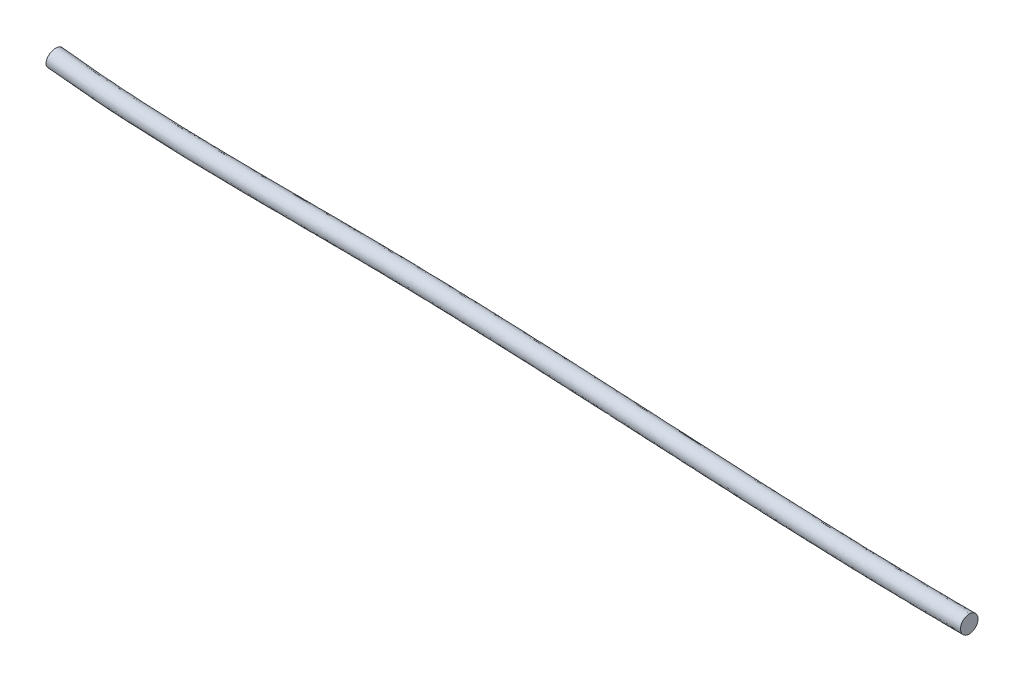
ISO-10303-21;
HEADER;
FILE_DESCRIPTION(('STEP AP214'),'2;1');
FILE_NAME('part.step','',(''),(''),'','','');
FILE_SCHEMA(('AUTOMOTIVE_DESIGN { 1 0 10303 214 1 1 1 1 }'));
ENDSEC;
DATA;
#1=APPLICATION_CONTEXT('core data for automotive mechanical design processes');
#2=APPLICATION_PROTOCOL_DEFINITION('international standard','automotive_design',2000,#1);
#3=PRODUCT_CONTEXT('',#1,'mechanical');
#4=PRODUCT('Part','Part','',(#3));
#5=PRODUCT_RELATED_PRODUCT_CATEGORY('part','',(#4));
#6=PRODUCT_DEFINITION_FORMATION('','',#4);
#7=PRODUCT_DEFINITION_CONTEXT('part definition',#1,'design');
#8=PRODUCT_DEFINITION('design','',#6,#7);
#9=PRODUCT_DEFINITION_SHAPE('','',#8);
#10=(LENGTH_UNIT() NAMED_UNIT(*) SI_UNIT(.MILLI.,.METRE.));
#11=(NAMED_UNIT(*) PLANE_ANGLE_UNIT() SI_UNIT($,.RADIAN.));
#12=(NAMED_UNIT(*) SI_UNIT($,.STERADIAN.) SOLID_ANGLE_UNIT());
#13=UNCERTAINTY_MEASURE_WITH_UNIT(LENGTH_MEASURE(1.E-05),#10,'distance_accuracy_value','');
#14=(GEOMETRIC_REPRESENTATION_CONTEXT(3) GLOBAL_UNCERTAINTY_ASSIGNED_CONTEXT((#13)) GLOBAL_UNIT_ASSIGNED_CONTEXT((#10,
#11,#12)) REPRESENTATION_CONTEXT('',''));
#15=CARTESIAN_POINT('',(0.,0.,0.));
#16=DIRECTION('',(0.,0.,1.));
#17=DIRECTION('',(1.,0.,0.));
#18=AXIS2_PLACEMENT_3D('',#15,#16,#17);
#19=CARTESIAN_POINT('',(-45.0248996878404,7.077953315822,0.));
#20=DIRECTION('',(0.993142350607384,-0.116911382807834,0.));
#21=DIRECTION('',(0.116911382807834,0.993142350607384,0.));
#22=AXIS2_PLACEMENT_3D('',#19,#20,#21);
#23=PLANE('',#22);
#24=CARTESIAN_POINT('',(-45.0248996878404,7.077953315822,0.));
#25=DIRECTION('',(0.993142350607384,-0.116911382807834,0.));
#26=DIRECTION('',(0.116911382807834,0.993142350607384,0.));
#27=AXIS2_PLACEMENT_3D('',#24,#25,#26);
#28=CIRCLE('',#27,0.05);
#29=CARTESIAN_POINT('',(-45.0190541187001,7.12761043335237,0.));
#30=VERTEX_POINT('',#29);
#31=EDGE_CURVE('E45',#30,#30,#28,.T.);
#32=ORIENTED_EDGE('',*,*,#31,.F.);
#33=EDGE_LOOP('',(#32));
#34=FACE_BOUND('',#33,.T.);
#35=ADVANCED_FACE('F38',(#34),#23,.F.);
#36=CARTESIAN_POINT('',(-39.7980106267384,6.88691407509623,0.));
#37=DIRECTION('',(0.999998511551187,-0.00172536819571345,0.));
#38=DIRECTION('',(0.00172536819571345,0.999998511551187,0.));
#39=AXIS2_PLACEMENT_3D('',#36,#37,#38);
#40=PLANE('',#39);
#41=CARTESIAN_POINT('',(-39.7980106267384,6.88691407509623,0.));
#42=DIRECTION('',(0.999998511551187,-0.00172536819571345,0.));
#43=DIRECTION('',(0.00172536819571345,0.999998511551187,0.));
#44=AXIS2_PLACEMENT_3D('',#41,#42,#43);
#45=CIRCLE('',#44,0.05);
#46=CARTESIAN_POINT('',(-39.7979243583286,6.93691400067379,0.));
#47=VERTEX_POINT('',#46);
#48=EDGE_CURVE('E12',#47,#47,#45,.T.);
#49=ORIENTED_EDGE('',*,*,#48,.T.);
#50=EDGE_LOOP('',(#49));
#51=FACE_BOUND('',#50,.T.);
#52=ADVANCED_FACE('F52',(#51),#40,.T.);
#53=CARTESIAN_POINT('',(-45.0190541187001,7.12761043335237,0.));
#54=CARTESIAN_POINT('',(-44.392824294345,7.05389152218229,0.));
#55=CARTESIAN_POINT('',(-43.7601170802473,7.07309965572654,0.));
#56=CARTESIAN_POINT('',(-42.0123646439502,7.04590727244154,0.));
#57=CARTESIAN_POINT('',(-40.9053275746569,6.93882469342463,0.));
#58=CARTESIAN_POINT('',(-39.7979243583286,6.93691400067379,0.));
#59=CARTESIAN_POINT('',(-45.0190541187001,7.12761043335237,0.1));
#60=CARTESIAN_POINT('',(-44.392824294345,7.05389152218229,0.1));
#61=CARTESIAN_POINT('',(-43.7601170802473,7.07309965572654,0.1));
#62=CARTESIAN_POINT('',(-42.0123646439502,7.04590727244154,0.1));
#63=CARTESIAN_POINT('',(-40.9053275746569,6.93882469342463,0.1));
#64=CARTESIAN_POINT('',(-39.7979243583286,6.93691400067379,0.1));
#65=CARTESIAN_POINT('',(-45.0307452569808,7.02829619829163,0.1));
#66=CARTESIAN_POINT('',(-44.3947775172343,6.95343095381857,0.1));
#67=CARTESIAN_POINT('',(-43.7585939135616,6.97306385492596,0.1));
#68=CARTESIAN_POINT('',(-42.0193140230387,6.94600329173876,0.1));
#69=CARTESIAN_POINT('',(-40.9118160874407,6.83883573986525,0.1));
#70=CARTESIAN_POINT('',(-39.7980968951482,6.83691414951867,0.1));
#71=CARTESIAN_POINT('',(-45.0307452569808,7.02829619829163,0.));
#72=CARTESIAN_POINT('',(-44.3947775172343,6.95343095381857,0.));
#73=CARTESIAN_POINT('',(-43.7585939135616,6.97306385492595,0.));
#74=CARTESIAN_POINT('',(-42.0193140230387,6.94600329173876,0.));
#75=CARTESIAN_POINT('',(-40.9118160874407,6.83883573986525,0.));
#76=CARTESIAN_POINT('',(-39.7980968951482,6.83691414951867,0.));
#77=CARTESIAN_POINT('',(-45.0307452569808,7.02829619829163,-0.1));
#78=CARTESIAN_POINT('',(-44.3947775172343,6.95343095381857,-0.1));
#79=CARTESIAN_POINT('',(-43.7585939135616,6.97306385492596,-0.1));
#80=CARTESIAN_POINT('',(-42.0193140230387,6.94600329173876,-0.1));
#81=CARTESIAN_POINT('',(-40.9118160874407,6.83883573986525,-0.1));
#82=CARTESIAN_POINT('',(-39.7980968951482,6.83691414951867,-0.1));
#83=CARTESIAN_POINT('',(-45.0190541187001,7.12761043335237,-0.1));
#84=CARTESIAN_POINT('',(-44.392824294345,7.05389152218229,-0.1));
#85=CARTESIAN_POINT('',(-43.7601170802473,7.07309965572654,-0.1));
#86=CARTESIAN_POINT('',(-42.0123646439502,7.04590727244154,-0.1));
#87=CARTESIAN_POINT('',(-40.9053275746569,6.93882469342463,-0.1));
#88=CARTESIAN_POINT('',(-39.7979243583286,6.93691400067379,-0.1));
#89=CARTESIAN_POINT('',(-45.0190541187001,7.12761043335237,0.));
#90=CARTESIAN_POINT('',(-44.392824294345,7.05389152218229,0.));
#91=CARTESIAN_POINT('',(-43.7601170802473,7.07309965572654,0.));
#92=CARTESIAN_POINT('',(-42.0123646439502,7.04590727244154,0.));
#93=CARTESIAN_POINT('',(-40.9053275746569,6.93882469342463,0.));
#94=CARTESIAN_POINT('',(-39.7979243583286,6.93691400067379,0.));
#95=(BOUNDED_SURFACE() B_SPLINE_SURFACE(3,3,((#53,#54,#55,#56,#57,#58),(#59,#60,#61,#62,#63,
#64),(#65,#66,#67,#68,#69,#70),(#71,#72,#73,#74,#75,#76),(#77,#78,#79,#80,#81,#82),(#83,#84,#85,
#86,#87,#88),(#89,#90,#91,#92,#93,#94)),.UNSPECIFIED.,.T.,.F.,
.F.) B_SPLINE_SURFACE_WITH_KNOTS((4,3,4),(4,2,4),(0.,0.5,1.),(0.,0.363388589735384,1.),
.UNSPECIFIED.) GEOMETRIC_REPRESENTATION_ITEM() RATIONAL_B_SPLINE_SURFACE(((1.,1.,1.,1.,1.,1.),
(0.333333333333333,0.333333333333333,0.333333333333333,0.333333333333333,0.333333333333333,
0.333333333333333),(0.333333333333333,0.333333333333333,0.333333333333333,0.333333333333333,
0.333333333333333,0.333333333333333),(1.,1.,1.,1.,1.,1.),(0.333333333333333,0.333333333333333,
0.333333333333333,0.333333333333333,0.333333333333333,0.333333333333333),(0.333333333333333,
0.333333333333333,0.333333333333333,0.333333333333333,0.333333333333333,0.333333333333333),(1.,
1.,1.,1.,1.,1.))) REPRESENTATION_ITEM('') SURFACE());
#96=ORIENTED_EDGE('',*,*,#48,.F.);
#97=EDGE_LOOP('',(#96));
#98=FACE_BOUND('',#97,.T.);
#99=ORIENTED_EDGE('',*,*,#31,.T.);
#100=EDGE_LOOP('',(#99));
#101=FACE_BOUND('',#100,.T.);
#102=ADVANCED_FACE('F54',(#98,#101),#95,.T.);
#103=CLOSED_SHELL('',(#35,#52,#102));
#104=MANIFOLD_SOLID_BREP('B2',#103);
#105=ADVANCED_BREP_SHAPE_REPRESENTATION('',(#18,#104),#14);
#106=SHAPE_DEFINITION_REPRESENTATION(#9,#105);
ENDSEC;
END-ISO-10303-21;
